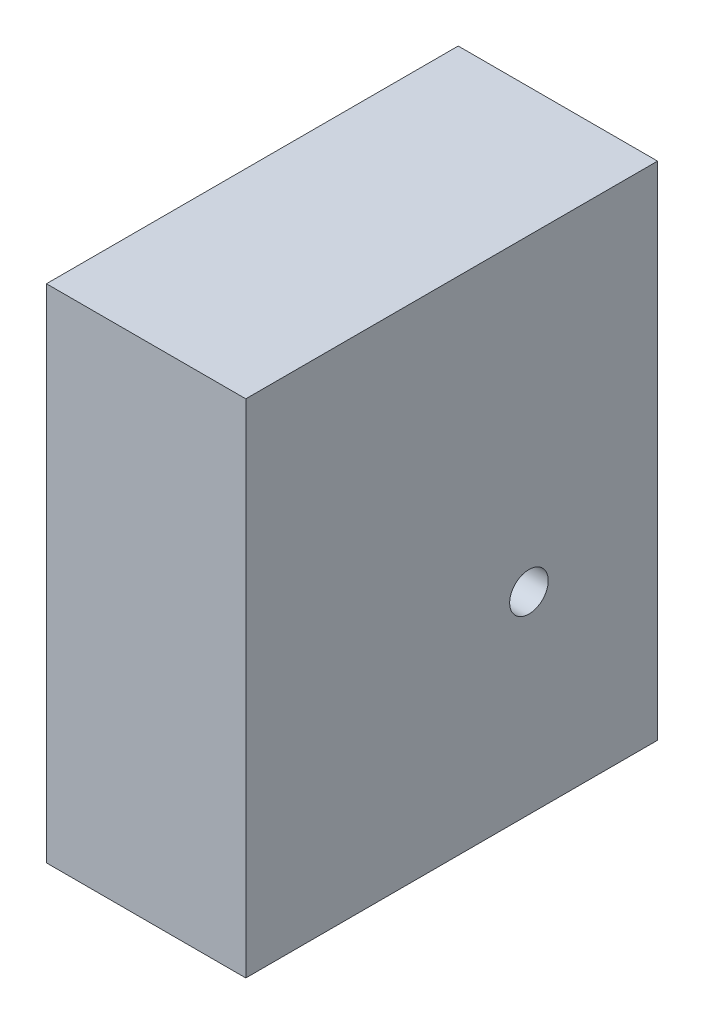
ISO-10303-21;
HEADER;
FILE_DESCRIPTION(('STEP AP214'),'2;1');
FILE_NAME('part.step','',(''),(''),'','','');
FILE_SCHEMA(('AUTOMOTIVE_DESIGN { 1 0 10303 214 1 1 1 1 }'));
ENDSEC;
DATA;
#1=APPLICATION_CONTEXT('core data for automotive mechanical design processes');
#2=APPLICATION_PROTOCOL_DEFINITION('international standard','automotive_design',2000,#1);
#3=PRODUCT_CONTEXT('',#1,'mechanical');
#4=PRODUCT('Part','Part','',(#3));
#5=PRODUCT_RELATED_PRODUCT_CATEGORY('part','',(#4));
#6=PRODUCT_DEFINITION_FORMATION('','',#4);
#7=PRODUCT_DEFINITION_CONTEXT('part definition',#1,'design');
#8=PRODUCT_DEFINITION('design','',#6,#7);
#9=PRODUCT_DEFINITION_SHAPE('','',#8);
#10=(LENGTH_UNIT() NAMED_UNIT(*) SI_UNIT(.MILLI.,.METRE.));
#11=(NAMED_UNIT(*) PLANE_ANGLE_UNIT() SI_UNIT($,.RADIAN.));
#12=(NAMED_UNIT(*) SI_UNIT($,.STERADIAN.) SOLID_ANGLE_UNIT());
#13=UNCERTAINTY_MEASURE_WITH_UNIT(LENGTH_MEASURE(1.E-05),#10,'distance_accuracy_value','');
#14=(GEOMETRIC_REPRESENTATION_CONTEXT(3) GLOBAL_UNCERTAINTY_ASSIGNED_CONTEXT((#13)) GLOBAL_UNIT_ASSIGNED_CONTEXT((#10,
#11,#12)) REPRESENTATION_CONTEXT('',''));
#15=CARTESIAN_POINT('',(0.,0.,0.));
#16=DIRECTION('',(0.,0.,1.));
#17=DIRECTION('',(1.,0.,0.));
#18=AXIS2_PLACEMENT_3D('',#15,#16,#17);
#19=CARTESIAN_POINT('',(77.5,195.,320.16));
#20=DIRECTION('',(-1.,0.,0.));
#21=DIRECTION('',(0.,-1.,0.));
#22=AXIS2_PLACEMENT_3D('',#19,#20,#21);
#23=PLANE('',#22);
#24=CARTESIAN_POINT('',(77.5000000000001,-45.,100.));
#25=DIRECTION('',(-1.,0.,0.));
#26=DIRECTION('',(0.,-1.,0.));
#27=AXIS2_PLACEMENT_3D('',#24,#25,#26);
#28=CIRCLE('',#27,15.);
#29=CARTESIAN_POINT('',(77.5000000000001,-60.,100.));
#30=VERTEX_POINT('',#29);
#31=EDGE_CURVE('E143',#30,#30,#28,.T.);
#32=ORIENTED_EDGE('',*,*,#31,.T.);
#33=EDGE_LOOP('',(#32));
#34=FACE_BOUND('',#33,.T.);
#35=DIRECTION('',(0.,1.,0.));
#36=VECTOR('',#35,1.);
#37=CARTESIAN_POINT('',(77.5,195.,0.));
#38=LINE('',#37,#36);
#39=CARTESIAN_POINT('',(77.5000000000001,-195.,0.));
#40=VERTEX_POINT('',#39);
#41=CARTESIAN_POINT('',(77.5,195.,0.));
#42=VERTEX_POINT('',#41);
#43=EDGE_CURVE('E161',#40,#42,#38,.T.);
#44=ORIENTED_EDGE('',*,*,#43,.T.);
#45=DIRECTION('',(0.,0.,-1.));
#46=VECTOR('',#45,1.);
#47=CARTESIAN_POINT('',(77.5,195.,320.16));
#48=LINE('',#47,#46);
#49=CARTESIAN_POINT('',(77.5,195.,320.16));
#50=VERTEX_POINT('',#49);
#51=EDGE_CURVE('E11',#50,#42,#48,.T.);
#52=ORIENTED_EDGE('',*,*,#51,.F.);
#53=DIRECTION('',(0.,1.,0.));
#54=VECTOR('',#53,1.);
#55=CARTESIAN_POINT('',(77.5,195.,320.16));
#56=LINE('',#55,#54);
#57=CARTESIAN_POINT('',(77.5000000000001,-195.,320.16));
#58=VERTEX_POINT('',#57);
#59=EDGE_CURVE('E167',#58,#50,#56,.T.);
#60=ORIENTED_EDGE('',*,*,#59,.F.);
#61=DIRECTION('',(0.,0.,-1.));
#62=VECTOR('',#61,1.);
#63=CARTESIAN_POINT('',(77.5000000000001,-195.,320.16));
#64=LINE('',#63,#62);
#65=EDGE_CURVE('E177',#58,#40,#64,.T.);
#66=ORIENTED_EDGE('',*,*,#65,.T.);
#67=EDGE_LOOP('',(#44,#52,#60,#66));
#68=FACE_BOUND('',#67,.T.);
#69=ADVANCED_FACE('F38',(#34,#68),#23,.F.);
#70=CARTESIAN_POINT('',(-77.5,195.,320.16));
#71=DIRECTION('',(0.,-1.,0.));
#72=DIRECTION('',(0.,0.,-1.));
#73=AXIS2_PLACEMENT_3D('',#70,#71,#72);
#74=PLANE('',#73);
#75=DIRECTION('',(-1.,0.,0.));
#76=VECTOR('',#75,1.);
#77=CARTESIAN_POINT('',(-77.5,195.,0.));
#78=LINE('',#77,#76);
#79=CARTESIAN_POINT('',(-77.5,195.,0.));
#80=VERTEX_POINT('',#79);
#81=EDGE_CURVE('E181',#42,#80,#78,.T.);
#82=ORIENTED_EDGE('',*,*,#81,.T.);
#83=DIRECTION('',(0.,0.,-1.));
#84=VECTOR('',#83,1.);
#85=CARTESIAN_POINT('',(-77.5,195.,320.16));
#86=LINE('',#85,#84);
#87=CARTESIAN_POINT('',(-77.5,195.,320.16));
#88=VERTEX_POINT('',#87);
#89=EDGE_CURVE('E47',#88,#80,#86,.T.);
#90=ORIENTED_EDGE('',*,*,#89,.F.);
#91=DIRECTION('',(-1.,0.,0.));
#92=VECTOR('',#91,1.);
#93=CARTESIAN_POINT('',(-77.5,195.,320.16));
#94=LINE('',#93,#92);
#95=EDGE_CURVE('E91',#50,#88,#94,.T.);
#96=ORIENTED_EDGE('',*,*,#95,.F.);
#97=ORIENTED_EDGE('',*,*,#51,.T.);
#98=EDGE_LOOP('',(#82,#90,#96,#97));
#99=FACE_BOUND('',#98,.T.);
#100=ADVANCED_FACE('F217',(#99),#74,.F.);
#101=CARTESIAN_POINT('',(-77.5,195.,320.16));
#102=DIRECTION('',(1.,0.,0.));
#103=DIRECTION('',(0.,1.,0.));
#104=AXIS2_PLACEMENT_3D('',#101,#102,#103);
#105=PLANE('',#104);
#106=CARTESIAN_POINT('',(-77.5,-45.,100.));
#107=DIRECTION('',(1.,0.,0.));
#108=DIRECTION('',(0.,1.,0.));
#109=AXIS2_PLACEMENT_3D('',#106,#107,#108);
#110=CIRCLE('',#109,15.);
#111=CARTESIAN_POINT('',(-77.5,-30.,100.));
#112=VERTEX_POINT('',#111);
#113=EDGE_CURVE('E238',#112,#112,#110,.T.);
#114=ORIENTED_EDGE('',*,*,#113,.T.);
#115=EDGE_LOOP('',(#114));
#116=FACE_BOUND('',#115,.T.);
#117=DIRECTION('',(0.,-1.,0.));
#118=VECTOR('',#117,1.);
#119=CARTESIAN_POINT('',(-77.5,195.,0.));
#120=LINE('',#119,#118);
#121=CARTESIAN_POINT('',(-77.4999999999999,-195.,0.));
#122=VERTEX_POINT('',#121);
#123=EDGE_CURVE('E184',#80,#122,#120,.T.);
#124=ORIENTED_EDGE('',*,*,#123,.T.);
#125=DIRECTION('',(0.,0.,-1.));
#126=VECTOR('',#125,1.);
#127=CARTESIAN_POINT('',(-77.4999999999999,-195.,320.16));
#128=LINE('',#127,#126);
#129=CARTESIAN_POINT('',(-77.4999999999999,-195.,320.16));
#130=VERTEX_POINT('',#129);
#131=EDGE_CURVE('E191',#130,#122,#128,.T.);
#132=ORIENTED_EDGE('',*,*,#131,.F.);
#133=DIRECTION('',(0.,-1.,0.));
#134=VECTOR('',#133,1.);
#135=CARTESIAN_POINT('',(-77.5,195.,320.16));
#136=LINE('',#135,#134);
#137=EDGE_CURVE('E172',#88,#130,#136,.T.);
#138=ORIENTED_EDGE('',*,*,#137,.F.);
#139=ORIENTED_EDGE('',*,*,#89,.T.);
#140=EDGE_LOOP('',(#124,#132,#138,#139));
#141=FACE_BOUND('',#140,.T.);
#142=ADVANCED_FACE('F199',(#116,#141),#105,.F.);
#143=CARTESIAN_POINT('',(-77.4999999999999,-195.,320.16));
#144=DIRECTION('',(0.,1.,0.));
#145=DIRECTION('',(0.,0.,1.));
#146=AXIS2_PLACEMENT_3D('',#143,#144,#145);
#147=PLANE('',#146);
#148=DIRECTION('',(1.,0.,0.));
#149=VECTOR('',#148,1.);
#150=CARTESIAN_POINT('',(-77.4999999999999,-195.,0.));
#151=LINE('',#150,#149);
#152=EDGE_CURVE('E84',#122,#40,#151,.T.);
#153=ORIENTED_EDGE('',*,*,#152,.T.);
#154=ORIENTED_EDGE('',*,*,#65,.F.);
#155=DIRECTION('',(1.,0.,0.));
#156=VECTOR('',#155,1.);
#157=CARTESIAN_POINT('',(-77.4999999999999,-195.,320.16));
#158=LINE('',#157,#156);
#159=EDGE_CURVE('E63',#130,#58,#158,.T.);
#160=ORIENTED_EDGE('',*,*,#159,.F.);
#161=ORIENTED_EDGE('',*,*,#131,.T.);
#162=EDGE_LOOP('',(#153,#154,#160,#161));
#163=FACE_BOUND('',#162,.T.);
#164=ADVANCED_FACE('F207',(#163),#147,.F.);
#165=CARTESIAN_POINT('',(0.,0.,320.16));
#166=DIRECTION('',(0.,0.,1.));
#167=DIRECTION('',(1.,0.,0.));
#168=AXIS2_PLACEMENT_3D('',#165,#166,#167);
#169=PLANE('',#168);
#170=ORIENTED_EDGE('',*,*,#59,.T.);
#171=ORIENTED_EDGE('',*,*,#95,.T.);
#172=ORIENTED_EDGE('',*,*,#137,.T.);
#173=ORIENTED_EDGE('',*,*,#159,.T.);
#174=EDGE_LOOP('',(#170,#171,#172,#173));
#175=FACE_BOUND('',#174,.T.);
#176=ADVANCED_FACE('F209',(#175),#169,.T.);
#177=CARTESIAN_POINT('',(0.,0.,0.));
#178=DIRECTION('',(0.,0.,1.));
#179=DIRECTION('',(1.,0.,0.));
#180=AXIS2_PLACEMENT_3D('',#177,#178,#179);
#181=PLANE('',#180);
#182=DIRECTION('',(1.,0.,0.));
#183=VECTOR('',#182,1.);
#184=CARTESIAN_POINT('',(50.,4.99999999999997,0.));
#185=LINE('',#184,#183);
#186=CARTESIAN_POINT('',(-50.,4.99999999999996,0.));
#187=VERTEX_POINT('',#186);
#188=CARTESIAN_POINT('',(50.,4.99999999999997,0.));
#189=VERTEX_POINT('',#188);
#190=EDGE_CURVE('E152',#187,#189,#185,.T.);
#191=ORIENTED_EDGE('',*,*,#190,.F.);
#192=DIRECTION('',(0.,1.,0.));
#193=VECTOR('',#192,1.);
#194=CARTESIAN_POINT('',(-50.,4.99999999999996,0.));
#195=LINE('',#194,#193);
#196=CARTESIAN_POINT('',(-50.,-95.,0.));
#197=VERTEX_POINT('',#196);
#198=EDGE_CURVE('E54',#197,#187,#195,.T.);
#199=ORIENTED_EDGE('',*,*,#198,.F.);
#200=DIRECTION('',(-1.,0.,0.));
#201=VECTOR('',#200,1.);
#202=CARTESIAN_POINT('',(50.,-95.0000000000001,0.));
#203=LINE('',#202,#201);
#204=CARTESIAN_POINT('',(50.,-95.0000000000001,0.));
#205=VERTEX_POINT('',#204);
#206=EDGE_CURVE('E136',#205,#197,#203,.T.);
#207=ORIENTED_EDGE('',*,*,#206,.F.);
#208=DIRECTION('',(0.,-1.,0.));
#209=VECTOR('',#208,1.);
#210=CARTESIAN_POINT('',(50.,4.99999999999997,0.));
#211=LINE('',#210,#209);
#212=EDGE_CURVE('E140',#189,#205,#211,.T.);
#213=ORIENTED_EDGE('',*,*,#212,.F.);
#214=EDGE_LOOP('',(#191,#199,#207,#213));
#215=FACE_BOUND('',#214,.T.);
#216=ORIENTED_EDGE('',*,*,#43,.F.);
#217=ORIENTED_EDGE('',*,*,#152,.F.);
#218=ORIENTED_EDGE('',*,*,#123,.F.);
#219=ORIENTED_EDGE('',*,*,#81,.F.);
#220=EDGE_LOOP('',(#216,#217,#218,#219));
#221=FACE_BOUND('',#220,.T.);
#222=ADVANCED_FACE('F203',(#215,#221),#181,.F.);
#223=CARTESIAN_POINT('',(-50.,4.99999999999996,150.));
#224=DIRECTION('',(-1.,0.,0.));
#225=DIRECTION('',(0.,-1.,0.));
#226=AXIS2_PLACEMENT_3D('',#223,#224,#225);
#227=PLANE('',#226);
#228=CARTESIAN_POINT('',(-50.,-45.,100.));
#229=DIRECTION('',(-1.,0.,0.));
#230=DIRECTION('',(0.,-1.,0.));
#231=AXIS2_PLACEMENT_3D('',#228,#229,#230);
#232=CIRCLE('',#231,15.);
#233=CARTESIAN_POINT('',(-50.,-60.,100.));
#234=VERTEX_POINT('',#233);
#235=EDGE_CURVE('E231',#234,#234,#232,.T.);
#236=ORIENTED_EDGE('',*,*,#235,.T.);
#237=EDGE_LOOP('',(#236));
#238=FACE_BOUND('',#237,.T.);
#239=ORIENTED_EDGE('',*,*,#198,.T.);
#240=DIRECTION('',(0.,0.,-1.));
#241=VECTOR('',#240,1.);
#242=CARTESIAN_POINT('',(-50.,4.99999999999996,150.));
#243=LINE('',#242,#241);
#244=CARTESIAN_POINT('',(-50.,4.99999999999996,150.));
#245=VERTEX_POINT('',#244);
#246=EDGE_CURVE('E111',#245,#187,#243,.T.);
#247=ORIENTED_EDGE('',*,*,#246,.F.);
#248=DIRECTION('',(0.,1.,0.));
#249=VECTOR('',#248,1.);
#250=CARTESIAN_POINT('',(-50.,4.99999999999996,150.));
#251=LINE('',#250,#249);
#252=CARTESIAN_POINT('',(-50.,-95.,150.));
#253=VERTEX_POINT('',#252);
#254=EDGE_CURVE('E115',#253,#245,#251,.T.);
#255=ORIENTED_EDGE('',*,*,#254,.F.);
#256=DIRECTION('',(0.,0.,-1.));
#257=VECTOR('',#256,1.);
#258=CARTESIAN_POINT('',(-50.,-95.,150.));
#259=LINE('',#258,#257);
#260=EDGE_CURVE('E158',#253,#197,#259,.T.);
#261=ORIENTED_EDGE('',*,*,#260,.T.);
#262=EDGE_LOOP('',(#239,#247,#255,#261));
#263=FACE_BOUND('',#262,.T.);
#264=ADVANCED_FACE('F113',(#238,#263),#227,.F.);
#265=CARTESIAN_POINT('',(50.,-95.0000000000001,150.));
#266=DIRECTION('',(0.,-1.,0.));
#267=DIRECTION('',(1.,0.,0.));
#268=AXIS2_PLACEMENT_3D('',#265,#266,#267);
#269=PLANE('',#268);
#270=ORIENTED_EDGE('',*,*,#206,.T.);
#271=ORIENTED_EDGE('',*,*,#260,.F.);
#272=DIRECTION('',(-1.,0.,0.));
#273=VECTOR('',#272,1.);
#274=CARTESIAN_POINT('',(50.,-95.0000000000001,150.));
#275=LINE('',#274,#273);
#276=CARTESIAN_POINT('',(50.,-95.0000000000001,150.));
#277=VERTEX_POINT('',#276);
#278=EDGE_CURVE('E122',#277,#253,#275,.T.);
#279=ORIENTED_EDGE('',*,*,#278,.F.);
#280=DIRECTION('',(0.,0.,-1.));
#281=VECTOR('',#280,1.);
#282=CARTESIAN_POINT('',(50.,-95.0000000000001,150.));
#283=LINE('',#282,#281);
#284=EDGE_CURVE('E162',#277,#205,#283,.T.);
#285=ORIENTED_EDGE('',*,*,#284,.T.);
#286=EDGE_LOOP('',(#270,#271,#279,#285));
#287=FACE_BOUND('',#286,.T.);
#288=ADVANCED_FACE('F256',(#287),#269,.F.);
#289=CARTESIAN_POINT('',(50.,4.99999999999997,150.));
#290=DIRECTION('',(1.,0.,0.));
#291=DIRECTION('',(0.,1.,0.));
#292=AXIS2_PLACEMENT_3D('',#289,#290,#291);
#293=PLANE('',#292);
#294=CARTESIAN_POINT('',(50.,-45.,100.));
#295=DIRECTION('',(1.,0.,0.));
#296=DIRECTION('',(0.,1.,0.));
#297=AXIS2_PLACEMENT_3D('',#294,#295,#296);
#298=CIRCLE('',#297,15.);
#299=CARTESIAN_POINT('',(50.,-30.,100.));
#300=VERTEX_POINT('',#299);
#301=EDGE_CURVE('E41',#300,#300,#298,.T.);
#302=ORIENTED_EDGE('',*,*,#301,.T.);
#303=EDGE_LOOP('',(#302));
#304=FACE_BOUND('',#303,.T.);
#305=ORIENTED_EDGE('',*,*,#212,.T.);
#306=ORIENTED_EDGE('',*,*,#284,.F.);
#307=DIRECTION('',(0.,-1.,0.));
#308=VECTOR('',#307,1.);
#309=CARTESIAN_POINT('',(50.,4.99999999999997,150.));
#310=LINE('',#309,#308);
#311=CARTESIAN_POINT('',(50.,4.99999999999997,150.));
#312=VERTEX_POINT('',#311);
#313=EDGE_CURVE('E131',#312,#277,#310,.T.);
#314=ORIENTED_EDGE('',*,*,#313,.F.);
#315=DIRECTION('',(0.,0.,-1.));
#316=VECTOR('',#315,1.);
#317=CARTESIAN_POINT('',(50.,4.99999999999997,150.));
#318=LINE('',#317,#316);
#319=EDGE_CURVE('E121',#312,#189,#318,.T.);
#320=ORIENTED_EDGE('',*,*,#319,.T.);
#321=EDGE_LOOP('',(#305,#306,#314,#320));
#322=FACE_BOUND('',#321,.T.);
#323=ADVANCED_FACE('F259',(#304,#322),#293,.F.);
#324=CARTESIAN_POINT('',(50.,4.99999999999997,150.));
#325=DIRECTION('',(0.,1.,0.));
#326=DIRECTION('',(-1.,0.,0.));
#327=AXIS2_PLACEMENT_3D('',#324,#325,#326);
#328=PLANE('',#327);
#329=ORIENTED_EDGE('',*,*,#190,.T.);
#330=ORIENTED_EDGE('',*,*,#319,.F.);
#331=DIRECTION('',(1.,0.,0.));
#332=VECTOR('',#331,1.);
#333=CARTESIAN_POINT('',(50.,4.99999999999997,150.));
#334=LINE('',#333,#332);
#335=EDGE_CURVE('E125',#245,#312,#334,.T.);
#336=ORIENTED_EDGE('',*,*,#335,.F.);
#337=ORIENTED_EDGE('',*,*,#246,.T.);
#338=EDGE_LOOP('',(#329,#330,#336,#337));
#339=FACE_BOUND('',#338,.T.);
#340=ADVANCED_FACE('F126',(#339),#328,.F.);
#341=CARTESIAN_POINT('',(0.,0.,150.));
#342=DIRECTION('',(0.,0.,-1.));
#343=DIRECTION('',(-1.,0.,0.));
#344=AXIS2_PLACEMENT_3D('',#341,#342,#343);
#345=PLANE('',#344);
#346=ORIENTED_EDGE('',*,*,#254,.T.);
#347=ORIENTED_EDGE('',*,*,#335,.T.);
#348=ORIENTED_EDGE('',*,*,#313,.T.);
#349=ORIENTED_EDGE('',*,*,#278,.T.);
#350=EDGE_LOOP('',(#346,#347,#348,#349));
#351=FACE_BOUND('',#350,.T.);
#352=ADVANCED_FACE('F133',(#351),#345,.T.);
#353=CARTESIAN_POINT('',(-77.5,-45.,100.));
#354=DIRECTION('',(1.,0.,0.));
#355=DIRECTION('',(0.,1.,0.));
#356=AXIS2_PLACEMENT_3D('',#353,#354,#355);
#357=CYLINDRICAL_SURFACE('',#356,15.);
#358=ORIENTED_EDGE('',*,*,#301,.F.);
#359=EDGE_LOOP('',(#358));
#360=FACE_BOUND('',#359,.T.);
#361=ORIENTED_EDGE('',*,*,#31,.F.);
#362=EDGE_LOOP('',(#361));
#363=FACE_BOUND('',#362,.T.);
#364=ADVANCED_FACE('F247',(#360,#363),#357,.F.);
#365=ORIENTED_EDGE('',*,*,#113,.F.);
#366=EDGE_LOOP('',(#365));
#367=FACE_BOUND('',#366,.T.);
#368=ORIENTED_EDGE('',*,*,#235,.F.);
#369=EDGE_LOOP('',(#368));
#370=FACE_BOUND('',#369,.T.);
#371=ADVANCED_FACE('F244',(#367,#370),#357,.F.);
#372=CLOSED_SHELL('',(#69,#100,#142,#164,#176,#222,#264,#288,#323,#340,#352,#364,#371));
#373=MANIFOLD_SOLID_BREP('B2',#372);
#374=ADVANCED_BREP_SHAPE_REPRESENTATION('',(#18,#373),#14);
#375=SHAPE_DEFINITION_REPRESENTATION(#9,#374);
ENDSEC;
END-ISO-10303-21;
